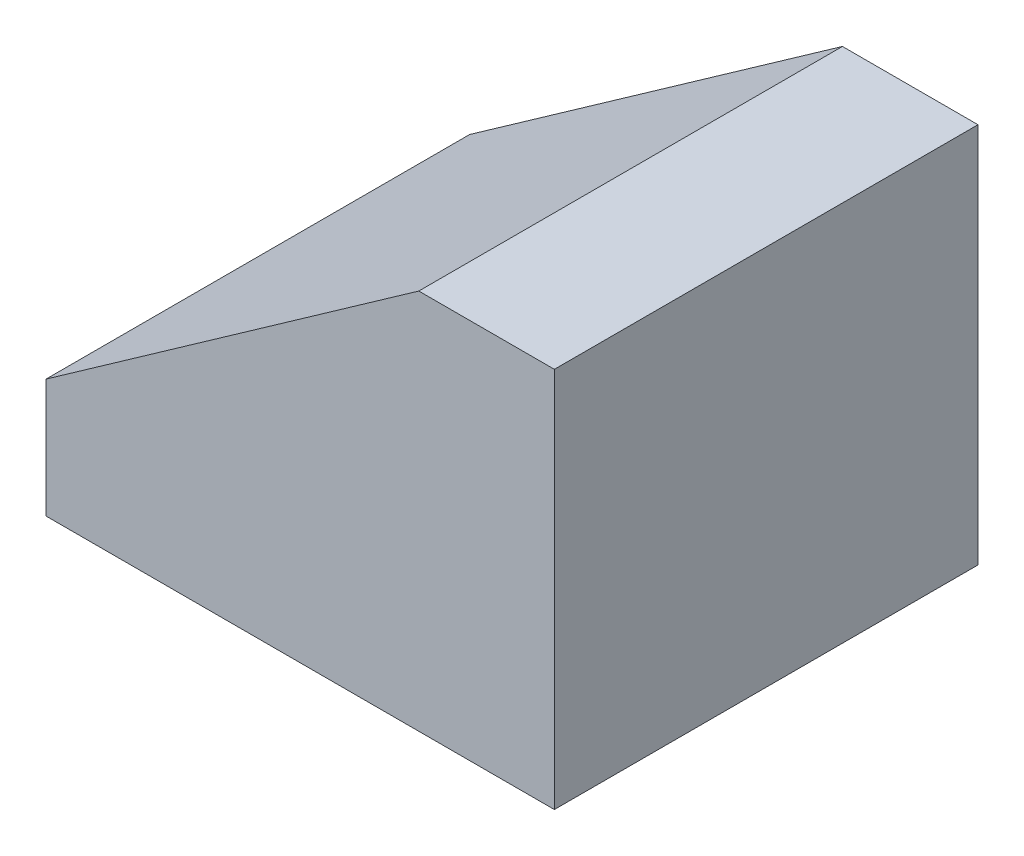
ISO-10303-21;
HEADER;
FILE_DESCRIPTION(('STEP AP214'),'2;1');
FILE_NAME('part.step','',(''),(''),'','','');
FILE_SCHEMA(('AUTOMOTIVE_DESIGN { 1 0 10303 214 1 1 1 1 }'));
ENDSEC;
DATA;
#1=APPLICATION_CONTEXT('core data for automotive mechanical design processes');
#2=APPLICATION_PROTOCOL_DEFINITION('international standard','automotive_design',2000,#1);
#3=PRODUCT_CONTEXT('',#1,'mechanical');
#4=PRODUCT('Part','Part','',(#3));
#5=PRODUCT_RELATED_PRODUCT_CATEGORY('part','',(#4));
#6=PRODUCT_DEFINITION_FORMATION('','',#4);
#7=PRODUCT_DEFINITION_CONTEXT('part definition',#1,'design');
#8=PRODUCT_DEFINITION('design','',#6,#7);
#9=PRODUCT_DEFINITION_SHAPE('','',#8);
#10=(LENGTH_UNIT() NAMED_UNIT(*) SI_UNIT(.MILLI.,.METRE.));
#11=(NAMED_UNIT(*) PLANE_ANGLE_UNIT() SI_UNIT($,.RADIAN.));
#12=(NAMED_UNIT(*) SI_UNIT($,.STERADIAN.) SOLID_ANGLE_UNIT());
#13=UNCERTAINTY_MEASURE_WITH_UNIT(LENGTH_MEASURE(1.E-05),#10,'distance_accuracy_value','');
#14=(GEOMETRIC_REPRESENTATION_CONTEXT(3) GLOBAL_UNCERTAINTY_ASSIGNED_CONTEXT((#13)) GLOBAL_UNIT_ASSIGNED_CONTEXT((#10,
#11,#12)) REPRESENTATION_CONTEXT('',''));
#15=CARTESIAN_POINT('',(0.,0.,0.));
#16=DIRECTION('',(0.,0.,1.));
#17=DIRECTION('',(1.,0.,0.));
#18=AXIS2_PLACEMENT_3D('',#15,#16,#17);
#19=CARTESIAN_POINT('',(0.,90.,100.));
#20=DIRECTION('',(-1.,0.,0.));
#21=DIRECTION('',(0.,-1.,0.));
#22=AXIS2_PLACEMENT_3D('',#19,#20,#21);
#23=PLANE('',#22);
#24=DIRECTION('',(0.,1.,0.));
#25=VECTOR('',#24,1.);
#26=CARTESIAN_POINT('',(0.,90.,0.));
#27=LINE('',#26,#25);
#28=CARTESIAN_POINT('',(0.,0.,0.));
#29=VERTEX_POINT('',#28);
#30=CARTESIAN_POINT('',(0.,90.,0.));
#31=VERTEX_POINT('',#30);
#32=EDGE_CURVE('E107',#29,#31,#27,.T.);
#33=ORIENTED_EDGE('',*,*,#32,.T.);
#34=DIRECTION('',(0.,0.,-1.));
#35=VECTOR('',#34,1.);
#36=CARTESIAN_POINT('',(0.,90.,100.));
#37=LINE('',#36,#35);
#38=CARTESIAN_POINT('',(0.,90.,100.));
#39=VERTEX_POINT('',#38);
#40=EDGE_CURVE('E11',#39,#31,#37,.T.);
#41=ORIENTED_EDGE('',*,*,#40,.F.);
#42=DIRECTION('',(0.,1.,0.));
#43=VECTOR('',#42,1.);
#44=CARTESIAN_POINT('',(0.,90.,100.));
#45=LINE('',#44,#43);
#46=CARTESIAN_POINT('',(0.,0.,100.));
#47=VERTEX_POINT('',#46);
#48=EDGE_CURVE('E115',#47,#39,#45,.T.);
#49=ORIENTED_EDGE('',*,*,#48,.F.);
#50=DIRECTION('',(0.,0.,-1.));
#51=VECTOR('',#50,1.);
#52=CARTESIAN_POINT('',(0.,0.,100.));
#53=LINE('',#52,#51);
#54=EDGE_CURVE('E103',#47,#29,#53,.T.);
#55=ORIENTED_EDGE('',*,*,#54,.T.);
#56=EDGE_LOOP('',(#33,#41,#49,#55));
#57=FACE_BOUND('',#56,.T.);
#58=ADVANCED_FACE('F33',(#57),#23,.F.);
#59=CARTESIAN_POINT('',(-32.,90.,100.));
#60=DIRECTION('',(0.,-1.,0.));
#61=DIRECTION('',(0.,0.,-1.));
#62=AXIS2_PLACEMENT_3D('',#59,#60,#61);
#63=PLANE('',#62);
#64=DIRECTION('',(-1.,0.,0.));
#65=VECTOR('',#64,1.);
#66=CARTESIAN_POINT('',(-32.,90.,0.));
#67=LINE('',#66,#65);
#68=CARTESIAN_POINT('',(-32.,90.,0.));
#69=VERTEX_POINT('',#68);
#70=EDGE_CURVE('E110',#31,#69,#67,.T.);
#71=ORIENTED_EDGE('',*,*,#70,.T.);
#72=DIRECTION('',(0.,0.,-1.));
#73=VECTOR('',#72,1.);
#74=CARTESIAN_POINT('',(-32.,90.,100.));
#75=LINE('',#74,#73);
#76=CARTESIAN_POINT('',(-32.,90.,100.));
#77=VERTEX_POINT('',#76);
#78=EDGE_CURVE('E41',#77,#69,#75,.T.);
#79=ORIENTED_EDGE('',*,*,#78,.F.);
#80=DIRECTION('',(-1.,0.,0.));
#81=VECTOR('',#80,1.);
#82=CARTESIAN_POINT('',(-32.,90.,100.));
#83=LINE('',#82,#81);
#84=EDGE_CURVE('E83',#39,#77,#83,.T.);
#85=ORIENTED_EDGE('',*,*,#84,.F.);
#86=ORIENTED_EDGE('',*,*,#40,.T.);
#87=EDGE_LOOP('',(#71,#79,#85,#86));
#88=FACE_BOUND('',#87,.T.);
#89=ADVANCED_FACE('F134',(#88),#63,.F.);
#90=CARTESIAN_POINT('',(-120.,28.,100.));
#91=DIRECTION('',(0.575953532433186,-0.817482433130973,0.));
#92=DIRECTION('',(0.817482433130973,0.575953532433186,0.));
#93=AXIS2_PLACEMENT_3D('',#90,#91,#92);
#94=PLANE('',#93);
#95=DIRECTION('',(-0.817482433130973,-0.575953532433186,0.));
#96=VECTOR('',#95,1.);
#97=CARTESIAN_POINT('',(-120.,28.,0.));
#98=LINE('',#97,#96);
#99=CARTESIAN_POINT('',(-120.,28.,0.));
#100=VERTEX_POINT('',#99);
#101=EDGE_CURVE('E98',#69,#100,#98,.T.);
#102=ORIENTED_EDGE('',*,*,#101,.T.);
#103=DIRECTION('',(0.,0.,-1.));
#104=VECTOR('',#103,1.);
#105=CARTESIAN_POINT('',(-120.,28.,100.));
#106=LINE('',#105,#104);
#107=CARTESIAN_POINT('',(-120.,28.,100.));
#108=VERTEX_POINT('',#107);
#109=EDGE_CURVE('E95',#108,#100,#106,.T.);
#110=ORIENTED_EDGE('',*,*,#109,.F.);
#111=DIRECTION('',(-0.817482433130973,-0.575953532433186,0.));
#112=VECTOR('',#111,1.);
#113=CARTESIAN_POINT('',(-120.,28.,100.));
#114=LINE('',#113,#112);
#115=EDGE_CURVE('E87',#77,#108,#114,.T.);
#116=ORIENTED_EDGE('',*,*,#115,.F.);
#117=ORIENTED_EDGE('',*,*,#78,.T.);
#118=EDGE_LOOP('',(#102,#110,#116,#117));
#119=FACE_BOUND('',#118,.T.);
#120=ADVANCED_FACE('F96',(#119),#94,.F.);
#121=CARTESIAN_POINT('',(-120.,0.,100.));
#122=DIRECTION('',(1.,0.,0.));
#123=DIRECTION('',(0.,0.,-1.));
#124=AXIS2_PLACEMENT_3D('',#121,#122,#123);
#125=PLANE('',#124);
#126=DIRECTION('',(0.,-1.,0.));
#127=VECTOR('',#126,1.);
#128=CARTESIAN_POINT('',(-120.,0.,0.));
#129=LINE('',#128,#127);
#130=CARTESIAN_POINT('',(-120.,0.,0.));
#131=VERTEX_POINT('',#130);
#132=EDGE_CURVE('E69',#100,#131,#129,.T.);
#133=ORIENTED_EDGE('',*,*,#132,.T.);
#134=DIRECTION('',(0.,0.,-1.));
#135=VECTOR('',#134,1.);
#136=CARTESIAN_POINT('',(-120.,0.,100.));
#137=LINE('',#136,#135);
#138=CARTESIAN_POINT('',(-120.,0.,100.));
#139=VERTEX_POINT('',#138);
#140=EDGE_CURVE('E99',#139,#131,#137,.T.);
#141=ORIENTED_EDGE('',*,*,#140,.F.);
#142=DIRECTION('',(0.,-1.,0.));
#143=VECTOR('',#142,1.);
#144=CARTESIAN_POINT('',(-120.,0.,100.));
#145=LINE('',#144,#143);
#146=EDGE_CURVE('E91',#108,#139,#145,.T.);
#147=ORIENTED_EDGE('',*,*,#146,.F.);
#148=ORIENTED_EDGE('',*,*,#109,.T.);
#149=EDGE_LOOP('',(#133,#141,#147,#148));
#150=FACE_BOUND('',#149,.T.);
#151=ADVANCED_FACE('F101',(#150),#125,.F.);
#152=CARTESIAN_POINT('',(0.,0.,100.));
#153=DIRECTION('',(0.,1.,0.));
#154=DIRECTION('',(0.,0.,1.));
#155=AXIS2_PLACEMENT_3D('',#152,#153,#154);
#156=PLANE('',#155);
#157=DIRECTION('',(1.,0.,0.));
#158=VECTOR('',#157,1.);
#159=CARTESIAN_POINT('',(0.,0.,0.));
#160=LINE('',#159,#158);
#161=EDGE_CURVE('E75',#131,#29,#160,.T.);
#162=ORIENTED_EDGE('',*,*,#161,.T.);
#163=ORIENTED_EDGE('',*,*,#54,.F.);
#164=DIRECTION('',(1.,0.,0.));
#165=VECTOR('',#164,1.);
#166=CARTESIAN_POINT('',(0.,0.,100.));
#167=LINE('',#166,#165);
#168=EDGE_CURVE('E49',#139,#47,#167,.T.);
#169=ORIENTED_EDGE('',*,*,#168,.F.);
#170=ORIENTED_EDGE('',*,*,#140,.T.);
#171=EDGE_LOOP('',(#162,#163,#169,#170));
#172=FACE_BOUND('',#171,.T.);
#173=ADVANCED_FACE('F123',(#172),#156,.F.);
#174=CARTESIAN_POINT('',(0.,0.,100.));
#175=DIRECTION('',(0.,0.,-1.));
#176=DIRECTION('',(-1.,0.,0.));
#177=AXIS2_PLACEMENT_3D('',#174,#175,#176);
#178=PLANE('',#177);
#179=ORIENTED_EDGE('',*,*,#48,.T.);
#180=ORIENTED_EDGE('',*,*,#84,.T.);
#181=ORIENTED_EDGE('',*,*,#115,.T.);
#182=ORIENTED_EDGE('',*,*,#146,.T.);
#183=ORIENTED_EDGE('',*,*,#168,.T.);
#184=EDGE_LOOP('',(#179,#180,#181,#182,#183));
#185=FACE_BOUND('',#184,.T.);
#186=ADVANCED_FACE('F89',(#185),#178,.F.);
#187=CARTESIAN_POINT('',(0.,0.,0.));
#188=DIRECTION('',(0.,0.,-1.));
#189=DIRECTION('',(-1.,0.,0.));
#190=AXIS2_PLACEMENT_3D('',#187,#188,#189);
#191=PLANE('',#190);
#192=ORIENTED_EDGE('',*,*,#32,.F.);
#193=ORIENTED_EDGE('',*,*,#161,.F.);
#194=ORIENTED_EDGE('',*,*,#132,.F.);
#195=ORIENTED_EDGE('',*,*,#101,.F.);
#196=ORIENTED_EDGE('',*,*,#70,.F.);
#197=EDGE_LOOP('',(#192,#193,#194,#195,#196));
#198=FACE_BOUND('',#197,.T.);
#199=ADVANCED_FACE('F119',(#198),#191,.T.);
#200=CLOSED_SHELL('',(#58,#89,#120,#151,#173,#186,#199));
#201=MANIFOLD_SOLID_BREP('B2',#200);
#202=ADVANCED_BREP_SHAPE_REPRESENTATION('',(#18,#201),#14);
#203=SHAPE_DEFINITION_REPRESENTATION(#9,#202);
ENDSEC;
END-ISO-10303-21;
